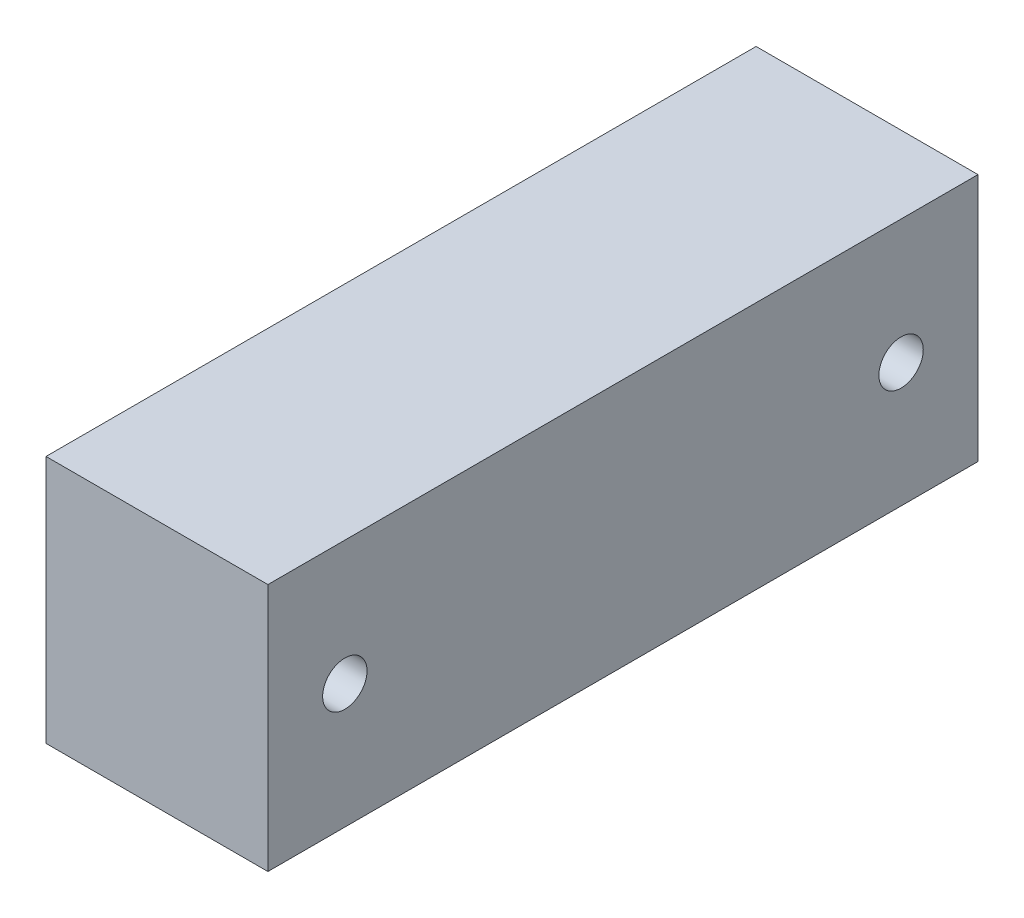
ISO-10303-21;
HEADER;
FILE_DESCRIPTION(('STEP AP214'),'2;1');
FILE_NAME('part.step','',(''),(''),'','','');
FILE_SCHEMA(('AUTOMOTIVE_DESIGN { 1 0 10303 214 1 1 1 1 }'));
ENDSEC;
DATA;
#1=APPLICATION_CONTEXT('core data for automotive mechanical design processes');
#2=APPLICATION_PROTOCOL_DEFINITION('international standard','automotive_design',2000,#1);
#3=PRODUCT_CONTEXT('',#1,'mechanical');
#4=PRODUCT('Part','Part','',(#3));
#5=PRODUCT_RELATED_PRODUCT_CATEGORY('part','',(#4));
#6=PRODUCT_DEFINITION_FORMATION('','',#4);
#7=PRODUCT_DEFINITION_CONTEXT('part definition',#1,'design');
#8=PRODUCT_DEFINITION('design','',#6,#7);
#9=PRODUCT_DEFINITION_SHAPE('','',#8);
#10=(LENGTH_UNIT() NAMED_UNIT(*) SI_UNIT(.MILLI.,.METRE.));
#11=(NAMED_UNIT(*) PLANE_ANGLE_UNIT() SI_UNIT($,.RADIAN.));
#12=(NAMED_UNIT(*) SI_UNIT($,.STERADIAN.) SOLID_ANGLE_UNIT());
#13=UNCERTAINTY_MEASURE_WITH_UNIT(LENGTH_MEASURE(1.E-05),#10,'distance_accuracy_value','');
#14=(GEOMETRIC_REPRESENTATION_CONTEXT(3) GLOBAL_UNCERTAINTY_ASSIGNED_CONTEXT((#13)) GLOBAL_UNIT_ASSIGNED_CONTEXT((#10,
#11,#12)) REPRESENTATION_CONTEXT('',''));
#15=CARTESIAN_POINT('',(0.,0.,0.));
#16=DIRECTION('',(0.,0.,1.));
#17=DIRECTION('',(1.,0.,0.));
#18=AXIS2_PLACEMENT_3D('',#15,#16,#17);
#19=CARTESIAN_POINT('',(15.,0.,0.));
#20=DIRECTION('',(-1.,0.,0.));
#21=DIRECTION('',(0.,0.,1.));
#22=AXIS2_PLACEMENT_3D('',#19,#20,#21);
#23=PLANE('',#22);
#24=CARTESIAN_POINT('',(15.,0.,18.8));
#25=DIRECTION('',(1.,0.,0.));
#26=DIRECTION('',(0.,0.,-1.));
#27=AXIS2_PLACEMENT_3D('',#24,#25,#26);
#28=CIRCLE('',#27,1.5);
#29=CARTESIAN_POINT('',(15.,0.,17.3));
#30=VERTEX_POINT('',#29);
#31=EDGE_CURVE('E100',#30,#30,#28,.T.);
#32=ORIENTED_EDGE('',*,*,#31,.F.);
#33=EDGE_LOOP('',(#32));
#34=FACE_BOUND('',#33,.T.);
#35=DIRECTION('',(0.,1.,0.));
#36=VECTOR('',#35,1.);
#37=CARTESIAN_POINT('',(15.,-8.4,-24.));
#38=LINE('',#37,#36);
#39=CARTESIAN_POINT('',(15.,-8.4,-24.));
#40=VERTEX_POINT('',#39);
#41=CARTESIAN_POINT('',(15.,8.4,-24.));
#42=VERTEX_POINT('',#41);
#43=EDGE_CURVE('E85',#40,#42,#38,.T.);
#44=ORIENTED_EDGE('',*,*,#43,.T.);
#45=DIRECTION('',(0.,0.,1.));
#46=VECTOR('',#45,1.);
#47=CARTESIAN_POINT('',(15.,8.4,24.));
#48=LINE('',#47,#46);
#49=CARTESIAN_POINT('',(15.,8.4,24.));
#50=VERTEX_POINT('',#49);
#51=EDGE_CURVE('E80',#42,#50,#48,.T.);
#52=ORIENTED_EDGE('',*,*,#51,.T.);
#53=DIRECTION('',(0.,-1.,0.));
#54=VECTOR('',#53,1.);
#55=CARTESIAN_POINT('',(15.,-8.4,24.));
#56=LINE('',#55,#54);
#57=CARTESIAN_POINT('',(15.,-8.4,24.));
#58=VERTEX_POINT('',#57);
#59=EDGE_CURVE('E83',#50,#58,#56,.T.);
#60=ORIENTED_EDGE('',*,*,#59,.T.);
#61=DIRECTION('',(0.,0.,-1.));
#62=VECTOR('',#61,1.);
#63=CARTESIAN_POINT('',(15.,-8.4,24.));
#64=LINE('',#63,#62);
#65=EDGE_CURVE('E50',#58,#40,#64,.T.);
#66=ORIENTED_EDGE('',*,*,#65,.T.);
#67=EDGE_LOOP('',(#44,#52,#60,#66));
#68=FACE_BOUND('',#67,.T.);
#69=CARTESIAN_POINT('',(15.,0.,-18.8));
#70=DIRECTION('',(1.,0.,0.));
#71=DIRECTION('',(0.,0.,-1.));
#72=AXIS2_PLACEMENT_3D('',#69,#70,#71);
#73=CIRCLE('',#72,1.5);
#74=CARTESIAN_POINT('',(15.,0.,-20.3));
#75=VERTEX_POINT('',#74);
#76=EDGE_CURVE('E115',#75,#75,#73,.T.);
#77=ORIENTED_EDGE('',*,*,#76,.F.);
#78=EDGE_LOOP('',(#77));
#79=FACE_BOUND('',#78,.T.);
#80=ADVANCED_FACE('F33',(#34,#68,#79),#23,.F.);
#81=CARTESIAN_POINT('',(0.,0.,0.));
#82=DIRECTION('',(-1.,0.,0.));
#83=DIRECTION('',(0.,0.,1.));
#84=AXIS2_PLACEMENT_3D('',#81,#82,#83);
#85=PLANE('',#84);
#86=CARTESIAN_POINT('',(0.,0.,18.8));
#87=DIRECTION('',(1.,0.,0.));
#88=DIRECTION('',(0.,0.,-1.));
#89=AXIS2_PLACEMENT_3D('',#86,#87,#88);
#90=CIRCLE('',#89,1.5);
#91=CARTESIAN_POINT('',(0.,0.,17.3));
#92=VERTEX_POINT('',#91);
#93=EDGE_CURVE('E112',#92,#92,#90,.T.);
#94=ORIENTED_EDGE('',*,*,#93,.T.);
#95=EDGE_LOOP('',(#94));
#96=FACE_BOUND('',#95,.T.);
#97=DIRECTION('',(0.,1.,0.));
#98=VECTOR('',#97,1.);
#99=CARTESIAN_POINT('',(0.,-8.4,-24.));
#100=LINE('',#99,#98);
#101=CARTESIAN_POINT('',(0.,-8.4,-24.));
#102=VERTEX_POINT('',#101);
#103=CARTESIAN_POINT('',(0.,8.4,-24.));
#104=VERTEX_POINT('',#103);
#105=EDGE_CURVE('E97',#102,#104,#100,.T.);
#106=ORIENTED_EDGE('',*,*,#105,.F.);
#107=DIRECTION('',(0.,0.,-1.));
#108=VECTOR('',#107,1.);
#109=CARTESIAN_POINT('',(0.,-8.4,24.));
#110=LINE('',#109,#108);
#111=CARTESIAN_POINT('',(0.,-8.4,24.));
#112=VERTEX_POINT('',#111);
#113=EDGE_CURVE('E73',#112,#102,#110,.T.);
#114=ORIENTED_EDGE('',*,*,#113,.F.);
#115=DIRECTION('',(0.,-1.,0.));
#116=VECTOR('',#115,1.);
#117=CARTESIAN_POINT('',(0.,-8.4,24.));
#118=LINE('',#117,#116);
#119=CARTESIAN_POINT('',(0.,8.4,24.));
#120=VERTEX_POINT('',#119);
#121=EDGE_CURVE('E67',#120,#112,#118,.T.);
#122=ORIENTED_EDGE('',*,*,#121,.F.);
#123=DIRECTION('',(0.,0.,1.));
#124=VECTOR('',#123,1.);
#125=CARTESIAN_POINT('',(0.,8.4,24.));
#126=LINE('',#125,#124);
#127=EDGE_CURVE('E89',#104,#120,#126,.T.);
#128=ORIENTED_EDGE('',*,*,#127,.F.);
#129=EDGE_LOOP('',(#106,#114,#122,#128));
#130=FACE_BOUND('',#129,.T.);
#131=CARTESIAN_POINT('',(0.,0.,-18.8));
#132=DIRECTION('',(1.,0.,0.));
#133=DIRECTION('',(0.,0.,-1.));
#134=AXIS2_PLACEMENT_3D('',#131,#132,#133);
#135=CIRCLE('',#134,1.5);
#136=CARTESIAN_POINT('',(0.,0.,-20.3));
#137=VERTEX_POINT('',#136);
#138=EDGE_CURVE('E118',#137,#137,#135,.T.);
#139=ORIENTED_EDGE('',*,*,#138,.T.);
#140=EDGE_LOOP('',(#139));
#141=FACE_BOUND('',#140,.T.);
#142=ADVANCED_FACE('F108',(#96,#130,#141),#85,.T.);
#143=CARTESIAN_POINT('',(15.,-8.4,-24.));
#144=DIRECTION('',(0.,0.,1.));
#145=DIRECTION('',(1.,0.,0.));
#146=AXIS2_PLACEMENT_3D('',#143,#144,#145);
#147=PLANE('',#146);
#148=ORIENTED_EDGE('',*,*,#105,.T.);
#149=DIRECTION('',(-1.,0.,0.));
#150=VECTOR('',#149,1.);
#151=CARTESIAN_POINT('',(15.,8.4,-24.));
#152=LINE('',#151,#150);
#153=EDGE_CURVE('E11',#42,#104,#152,.T.);
#154=ORIENTED_EDGE('',*,*,#153,.F.);
#155=ORIENTED_EDGE('',*,*,#43,.F.);
#156=DIRECTION('',(-1.,0.,0.));
#157=VECTOR('',#156,1.);
#158=CARTESIAN_POINT('',(15.,-8.4,-24.));
#159=LINE('',#158,#157);
#160=EDGE_CURVE('E93',#40,#102,#159,.T.);
#161=ORIENTED_EDGE('',*,*,#160,.T.);
#162=EDGE_LOOP('',(#148,#154,#155,#161));
#163=FACE_BOUND('',#162,.T.);
#164=ADVANCED_FACE('F35',(#163),#147,.F.);
#165=CARTESIAN_POINT('',(15.,8.4,24.));
#166=DIRECTION('',(0.,-1.,0.));
#167=DIRECTION('',(0.,0.,-1.));
#168=AXIS2_PLACEMENT_3D('',#165,#166,#167);
#169=PLANE('',#168);
#170=ORIENTED_EDGE('',*,*,#127,.T.);
#171=DIRECTION('',(-1.,0.,0.));
#172=VECTOR('',#171,1.);
#173=CARTESIAN_POINT('',(15.,8.4,24.));
#174=LINE('',#173,#172);
#175=EDGE_CURVE('E42',#50,#120,#174,.T.);
#176=ORIENTED_EDGE('',*,*,#175,.F.);
#177=ORIENTED_EDGE('',*,*,#51,.F.);
#178=ORIENTED_EDGE('',*,*,#153,.T.);
#179=EDGE_LOOP('',(#170,#176,#177,#178));
#180=FACE_BOUND('',#179,.T.);
#181=ADVANCED_FACE('F88',(#180),#169,.F.);
#182=CARTESIAN_POINT('',(15.,-8.4,24.));
#183=DIRECTION('',(0.,0.,-1.));
#184=DIRECTION('',(-1.,0.,0.));
#185=AXIS2_PLACEMENT_3D('',#182,#183,#184);
#186=PLANE('',#185);
#187=ORIENTED_EDGE('',*,*,#121,.T.);
#188=DIRECTION('',(-1.,0.,0.));
#189=VECTOR('',#188,1.);
#190=CARTESIAN_POINT('',(15.,-8.4,24.));
#191=LINE('',#190,#189);
#192=EDGE_CURVE('E90',#58,#112,#191,.T.);
#193=ORIENTED_EDGE('',*,*,#192,.F.);
#194=ORIENTED_EDGE('',*,*,#59,.F.);
#195=ORIENTED_EDGE('',*,*,#175,.T.);
#196=EDGE_LOOP('',(#187,#193,#194,#195));
#197=FACE_BOUND('',#196,.T.);
#198=ADVANCED_FACE('F91',(#197),#186,.F.);
#199=CARTESIAN_POINT('',(15.,-8.4,24.));
#200=DIRECTION('',(0.,1.,0.));
#201=DIRECTION('',(0.,0.,1.));
#202=AXIS2_PLACEMENT_3D('',#199,#200,#201);
#203=PLANE('',#202);
#204=ORIENTED_EDGE('',*,*,#113,.T.);
#205=ORIENTED_EDGE('',*,*,#160,.F.);
#206=ORIENTED_EDGE('',*,*,#65,.F.);
#207=ORIENTED_EDGE('',*,*,#192,.T.);
#208=EDGE_LOOP('',(#204,#205,#206,#207));
#209=FACE_BOUND('',#208,.T.);
#210=ADVANCED_FACE('F105',(#209),#203,.F.);
#211=CARTESIAN_POINT('',(15.,0.,18.8));
#212=DIRECTION('',(-1.,0.,0.));
#213=DIRECTION('',(0.,0.,1.));
#214=AXIS2_PLACEMENT_3D('',#211,#212,#213);
#215=CYLINDRICAL_SURFACE('',#214,1.5);
#216=ORIENTED_EDGE('',*,*,#31,.T.);
#217=EDGE_LOOP('',(#216));
#218=FACE_BOUND('',#217,.T.);
#219=ORIENTED_EDGE('',*,*,#93,.F.);
#220=EDGE_LOOP('',(#219));
#221=FACE_BOUND('',#220,.T.);
#222=ADVANCED_FACE('F136',(#218,#221),#215,.F.);
#223=CARTESIAN_POINT('',(15.,0.,-18.8));
#224=DIRECTION('',(-1.,0.,0.));
#225=DIRECTION('',(0.,0.,1.));
#226=AXIS2_PLACEMENT_3D('',#223,#224,#225);
#227=CYLINDRICAL_SURFACE('',#226,1.5);
#228=ORIENTED_EDGE('',*,*,#76,.T.);
#229=EDGE_LOOP('',(#228));
#230=FACE_BOUND('',#229,.T.);
#231=ORIENTED_EDGE('',*,*,#138,.F.);
#232=EDGE_LOOP('',(#231));
#233=FACE_BOUND('',#232,.T.);
#234=ADVANCED_FACE('F124',(#230,#233),#227,.F.);
#235=CLOSED_SHELL('',(#80,#142,#164,#181,#198,#210,#222,#234));
#236=MANIFOLD_SOLID_BREP('B2',#235);
#237=ADVANCED_BREP_SHAPE_REPRESENTATION('',(#18,#236),#14);
#238=SHAPE_DEFINITION_REPRESENTATION(#9,#237);
ENDSEC;
END-ISO-10303-21;
